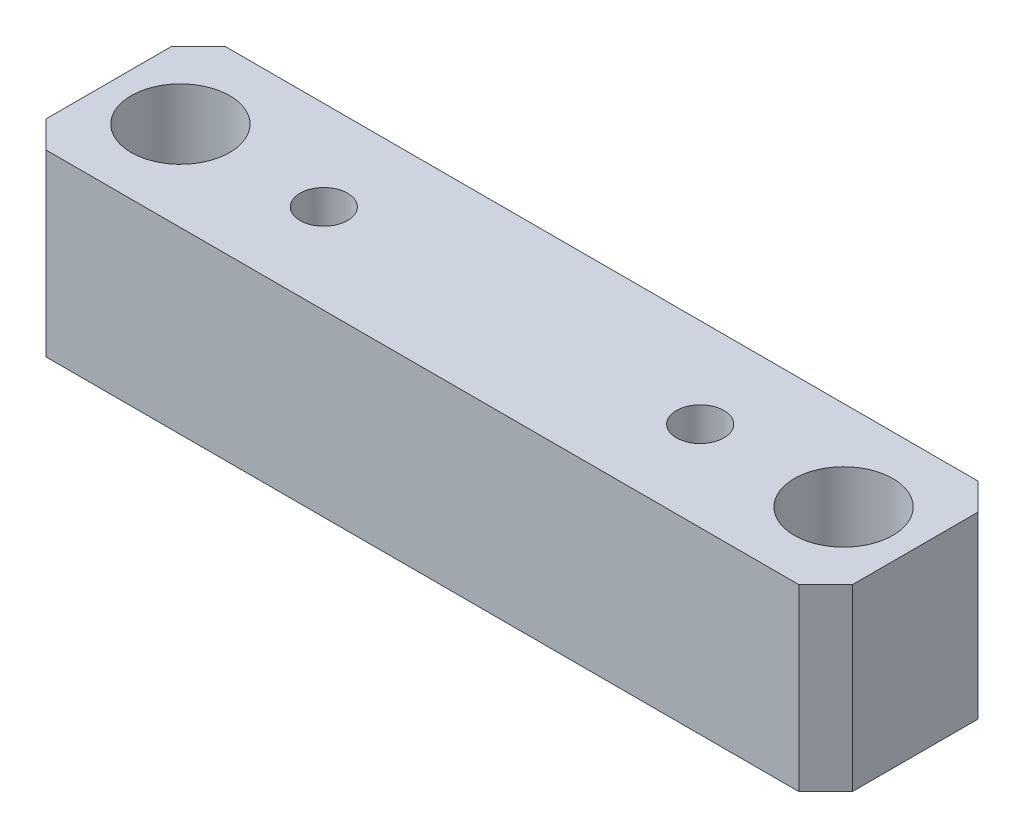
ISO-10303-21;
HEADER;
FILE_DESCRIPTION(('STEP AP214'),'2;1');
FILE_NAME('part.step','',(''),(''),'','','');
FILE_SCHEMA(('AUTOMOTIVE_DESIGN { 1 0 10303 214 1 1 1 1 }'));
ENDSEC;
DATA;
#1=APPLICATION_CONTEXT('core data for automotive mechanical design processes');
#2=APPLICATION_PROTOCOL_DEFINITION('international standard','automotive_design',2000,#1);
#3=PRODUCT_CONTEXT('',#1,'mechanical');
#4=PRODUCT('Part','Part','',(#3));
#5=PRODUCT_RELATED_PRODUCT_CATEGORY('part','',(#4));
#6=PRODUCT_DEFINITION_FORMATION('','',#4);
#7=PRODUCT_DEFINITION_CONTEXT('part definition',#1,'design');
#8=PRODUCT_DEFINITION('design','',#6,#7);
#9=PRODUCT_DEFINITION_SHAPE('','',#8);
#10=(LENGTH_UNIT() NAMED_UNIT(*) SI_UNIT(.MILLI.,.METRE.));
#11=(NAMED_UNIT(*) PLANE_ANGLE_UNIT() SI_UNIT($,.RADIAN.));
#12=(NAMED_UNIT(*) SI_UNIT($,.STERADIAN.) SOLID_ANGLE_UNIT());
#13=UNCERTAINTY_MEASURE_WITH_UNIT(LENGTH_MEASURE(1.E-05),#10,'distance_accuracy_value','');
#14=(GEOMETRIC_REPRESENTATION_CONTEXT(3) GLOBAL_UNCERTAINTY_ASSIGNED_CONTEXT((#13)) GLOBAL_UNIT_ASSIGNED_CONTEXT((#10,
#11,#12)) REPRESENTATION_CONTEXT('',''));
#15=CARTESIAN_POINT('',(0.,0.,0.));
#16=DIRECTION('',(0.,0.,1.));
#17=DIRECTION('',(1.,0.,0.));
#18=AXIS2_PLACEMENT_3D('',#15,#16,#17);
#19=CARTESIAN_POINT('',(-37.0000000000001,20.,0.));
#20=DIRECTION('',(0.,-1.,0.));
#21=DIRECTION('',(0.,0.,-1.));
#22=AXIS2_PLACEMENT_3D('',#19,#20,#21);
#23=CYLINDRICAL_SURFACE('',#22,2.75);
#24=CARTESIAN_POINT('',(-37.0000000000001,0.,0.));
#25=DIRECTION('',(0.,1.,0.));
#26=DIRECTION('',(0.,0.,1.));
#27=AXIS2_PLACEMENT_3D('',#24,#25,#26);
#28=CIRCLE('',#27,2.75);
#29=CARTESIAN_POINT('',(-37.0000000000001,0.,2.75));
#30=VERTEX_POINT('',#29);
#31=EDGE_CURVE('E334',#30,#30,#28,.T.);
#32=ORIENTED_EDGE('',*,*,#31,.F.);
#33=EDGE_LOOP('',(#32));
#34=FACE_BOUND('',#33,.T.);
#35=CARTESIAN_POINT('',(-37.0000000000001,6.,0.));
#36=DIRECTION('',(0.,1.,0.));
#37=DIRECTION('',(0.,0.,1.));
#38=AXIS2_PLACEMENT_3D('',#35,#36,#37);
#39=CIRCLE('',#38,2.75);
#40=CARTESIAN_POINT('',(-37.0000000000001,6.,2.75));
#41=VERTEX_POINT('',#40);
#42=EDGE_CURVE('E294',#41,#41,#39,.T.);
#43=ORIENTED_EDGE('',*,*,#42,.T.);
#44=EDGE_LOOP('',(#43));
#45=FACE_BOUND('',#44,.T.);
#46=ADVANCED_FACE('F42',(#34,#45),#23,.F.);
#47=CARTESIAN_POINT('',(36.9999999999999,20.,0.));
#48=DIRECTION('',(0.,-1.,0.));
#49=DIRECTION('',(0.,0.,-1.));
#50=AXIS2_PLACEMENT_3D('',#47,#48,#49);
#51=CYLINDRICAL_SURFACE('',#50,2.75);
#52=CARTESIAN_POINT('',(36.9999999999999,0.,0.));
#53=DIRECTION('',(0.,1.,0.));
#54=DIRECTION('',(0.,0.,1.));
#55=AXIS2_PLACEMENT_3D('',#52,#53,#54);
#56=CIRCLE('',#55,2.75);
#57=CARTESIAN_POINT('',(36.9999999999999,0.,2.75));
#58=VERTEX_POINT('',#57);
#59=EDGE_CURVE('E330',#58,#58,#56,.T.);
#60=ORIENTED_EDGE('',*,*,#59,.F.);
#61=EDGE_LOOP('',(#60));
#62=FACE_BOUND('',#61,.T.);
#63=CARTESIAN_POINT('',(36.9999999999999,6.,0.));
#64=DIRECTION('',(0.,1.,0.));
#65=DIRECTION('',(0.,0.,1.));
#66=AXIS2_PLACEMENT_3D('',#63,#64,#65);
#67=CIRCLE('',#66,2.75);
#68=CARTESIAN_POINT('',(36.9999999999999,6.,2.75));
#69=VERTEX_POINT('',#68);
#70=EDGE_CURVE('E383',#69,#69,#67,.T.);
#71=ORIENTED_EDGE('',*,*,#70,.T.);
#72=EDGE_LOOP('',(#71));
#73=FACE_BOUND('',#72,.T.);
#74=ADVANCED_FACE('F477',(#62,#73),#51,.F.);
#75=CARTESIAN_POINT('',(-21.,20.,0.));
#76=DIRECTION('',(0.,-1.,0.));
#77=DIRECTION('',(0.,0.,-1.));
#78=AXIS2_PLACEMENT_3D('',#75,#76,#77);
#79=CYLINDRICAL_SURFACE('',#78,2.65);
#80=CARTESIAN_POINT('',(-21.,20.,0.));
#81=DIRECTION('',(0.,1.,0.));
#82=DIRECTION('',(0.,0.,1.));
#83=AXIS2_PLACEMENT_3D('',#80,#81,#82);
#84=CIRCLE('',#83,2.65);
#85=CARTESIAN_POINT('',(-21.,20.,2.65));
#86=VERTEX_POINT('',#85);
#87=EDGE_CURVE('E343',#86,#86,#84,.T.);
#88=ORIENTED_EDGE('',*,*,#87,.T.);
#89=EDGE_LOOP('',(#88));
#90=FACE_BOUND('',#89,.T.);
#91=CARTESIAN_POINT('',(-21.,12.,0.));
#92=DIRECTION('',(0.,-1.,0.));
#93=DIRECTION('',(0.,0.,-1.));
#94=AXIS2_PLACEMENT_3D('',#91,#92,#93);
#95=CIRCLE('',#94,2.65);
#96=CARTESIAN_POINT('',(-21.,12.,-2.65));
#97=VERTEX_POINT('',#96);
#98=EDGE_CURVE('E335',#97,#97,#95,.T.);
#99=ORIENTED_EDGE('',*,*,#98,.T.);
#100=EDGE_LOOP('',(#99));
#101=FACE_BOUND('',#100,.T.);
#102=ADVANCED_FACE('F483',(#90,#101),#79,.F.);
#103=CARTESIAN_POINT('',(21.,20.,0.));
#104=DIRECTION('',(0.,-1.,0.));
#105=DIRECTION('',(0.,0.,-1.));
#106=AXIS2_PLACEMENT_3D('',#103,#104,#105);
#107=CYLINDRICAL_SURFACE('',#106,2.65);
#108=CARTESIAN_POINT('',(21.,20.,0.));
#109=DIRECTION('',(0.,1.,0.));
#110=DIRECTION('',(0.,0.,1.));
#111=AXIS2_PLACEMENT_3D('',#108,#109,#110);
#112=CIRCLE('',#111,2.65);
#113=CARTESIAN_POINT('',(21.,20.,2.64999999999999));
#114=VERTEX_POINT('',#113);
#115=EDGE_CURVE('E339',#114,#114,#112,.T.);
#116=ORIENTED_EDGE('',*,*,#115,.T.);
#117=EDGE_LOOP('',(#116));
#118=FACE_BOUND('',#117,.T.);
#119=CARTESIAN_POINT('',(21.,12.,0.));
#120=DIRECTION('',(0.,-1.,0.));
#121=DIRECTION('',(0.,0.,-1.));
#122=AXIS2_PLACEMENT_3D('',#119,#120,#121);
#123=CIRCLE('',#122,2.65);
#124=CARTESIAN_POINT('',(21.,12.,-2.65000000000001));
#125=VERTEX_POINT('',#124);
#126=EDGE_CURVE('E252',#125,#125,#123,.T.);
#127=ORIENTED_EDGE('',*,*,#126,.T.);
#128=EDGE_LOOP('',(#127));
#129=FACE_BOUND('',#128,.T.);
#130=ADVANCED_FACE('F490',(#118,#129),#107,.F.);
#131=CARTESIAN_POINT('',(0.,20.,0.));
#132=DIRECTION('',(0.,-1.,0.));
#133=DIRECTION('',(0.,0.,-1.));
#134=AXIS2_PLACEMENT_3D('',#131,#132,#133);
#135=PLANE('',#134);
#136=CARTESIAN_POINT('',(-37.0000000000001,20.,0.));
#137=DIRECTION('',(0.,1.,0.));
#138=DIRECTION('',(0.,0.,1.));
#139=AXIS2_PLACEMENT_3D('',#136,#137,#138);
#140=CIRCLE('',#139,5.5);
#141=CARTESIAN_POINT('',(-37.0000000000001,20.,5.5));
#142=VERTEX_POINT('',#141);
#143=EDGE_CURVE('E812',#142,#142,#140,.T.);
#144=ORIENTED_EDGE('',*,*,#143,.F.);
#145=EDGE_LOOP('',(#144));
#146=FACE_BOUND('',#145,.T.);
#147=CARTESIAN_POINT('',(36.9999999999999,20.,0.));
#148=DIRECTION('',(0.,1.,0.));
#149=DIRECTION('',(0.,0.,1.));
#150=AXIS2_PLACEMENT_3D('',#147,#148,#149);
#151=CIRCLE('',#150,5.5);
#152=CARTESIAN_POINT('',(36.9999999999999,20.,5.5));
#153=VERTEX_POINT('',#152);
#154=EDGE_CURVE('E218',#153,#153,#151,.T.);
#155=ORIENTED_EDGE('',*,*,#154,.F.);
#156=EDGE_LOOP('',(#155));
#157=FACE_BOUND('',#156,.T.);
#158=DIRECTION('',(1.,0.,0.));
#159=VECTOR('',#158,1.);
#160=CARTESIAN_POINT('',(-45.0000000000001,20.,10.));
#161=LINE('',#160,#159);
#162=CARTESIAN_POINT('',(-42.,20.,10.));
#163=VERTEX_POINT('',#162);
#164=CARTESIAN_POINT('',(41.9999999999999,20.,9.99999999999999));
#165=VERTEX_POINT('',#164);
#166=EDGE_CURVE('E359',#163,#165,#161,.T.);
#167=ORIENTED_EDGE('',*,*,#166,.T.);
#168=DIRECTION('',(-0.707106781186551,0.,0.707106781186544));
#169=VECTOR('',#168,1.);
#170=CARTESIAN_POINT('',(44.9999999999999,20.,6.99999999999999));
#171=LINE('',#170,#169);
#172=CARTESIAN_POINT('',(44.9999999999999,20.,6.99999999999999));
#173=VERTEX_POINT('',#172);
#174=EDGE_CURVE('E424',#165,#173,#171,.F.);
#175=ORIENTED_EDGE('',*,*,#174,.T.);
#176=DIRECTION('',(0.,0.,-1.));
#177=VECTOR('',#176,1.);
#178=CARTESIAN_POINT('',(44.9999999999999,20.,9.99999999999999));
#179=LINE('',#178,#177);
#180=CARTESIAN_POINT('',(44.9999999999999,20.,-6.99999999999996));
#181=VERTEX_POINT('',#180);
#182=EDGE_CURVE('E348',#173,#181,#179,.T.);
#183=ORIENTED_EDGE('',*,*,#182,.T.);
#184=DIRECTION('',(0.707106781186546,0.,0.707106781186549));
#185=VECTOR('',#184,1.);
#186=CARTESIAN_POINT('',(41.9999999999999,20.,-9.99999999999999));
#187=LINE('',#186,#185);
#188=CARTESIAN_POINT('',(41.9999999999999,20.,-9.99999999999999));
#189=VERTEX_POINT('',#188);
#190=EDGE_CURVE('E418',#181,#189,#187,.F.);
#191=ORIENTED_EDGE('',*,*,#190,.T.);
#192=DIRECTION('',(-1.,0.,0.));
#193=VECTOR('',#192,1.);
#194=CARTESIAN_POINT('',(-45.0000000000001,20.,-9.99999999999999));
#195=LINE('',#194,#193);
#196=CARTESIAN_POINT('',(-42.,20.,-9.99999999999999));
#197=VERTEX_POINT('',#196);
#198=EDGE_CURVE('E352',#189,#197,#195,.T.);
#199=ORIENTED_EDGE('',*,*,#198,.T.);
#200=DIRECTION('',(0.707106781186549,0.,-0.707106781186546));
#201=VECTOR('',#200,1.);
#202=CARTESIAN_POINT('',(-45.0000000000001,20.,-6.99999999999999));
#203=LINE('',#202,#201);
#204=CARTESIAN_POINT('',(-45.0000000000001,20.,-6.99999999999999));
#205=VERTEX_POINT('',#204);
#206=EDGE_CURVE('E66',#197,#205,#203,.F.);
#207=ORIENTED_EDGE('',*,*,#206,.T.);
#208=DIRECTION('',(0.,0.,1.));
#209=VECTOR('',#208,1.);
#210=CARTESIAN_POINT('',(-45.0000000000001,20.,10.));
#211=LINE('',#210,#209);
#212=CARTESIAN_POINT('',(-45.0000000000001,20.,6.99999999999999));
#213=VERTEX_POINT('',#212);
#214=EDGE_CURVE('E356',#205,#213,#211,.T.);
#215=ORIENTED_EDGE('',*,*,#214,.T.);
#216=DIRECTION('',(-0.707106781186546,0.,-0.707106781186549));
#217=VECTOR('',#216,1.);
#218=CARTESIAN_POINT('',(-42.,20.,10.));
#219=LINE('',#218,#217);
#220=EDGE_CURVE('E421',#213,#163,#219,.F.);
#221=ORIENTED_EDGE('',*,*,#220,.T.);
#222=EDGE_LOOP('',(#167,#175,#183,#191,#199,#207,#215,#221));
#223=FACE_BOUND('',#222,.T.);
#224=ORIENTED_EDGE('',*,*,#87,.F.);
#225=EDGE_LOOP('',(#224));
#226=FACE_BOUND('',#225,.T.);
#227=ORIENTED_EDGE('',*,*,#115,.F.);
#228=EDGE_LOOP('',(#227));
#229=FACE_BOUND('',#228,.T.);
#230=ADVANCED_FACE('F440',(#146,#157,#223,#226,#229),#135,.F.);
#231=CARTESIAN_POINT('',(0.,0.,0.));
#232=DIRECTION('',(0.,-1.,0.));
#233=DIRECTION('',(0.,0.,-1.));
#234=AXIS2_PLACEMENT_3D('',#231,#232,#233);
#235=PLANE('',#234);
#236=DIRECTION('',(0.5,0.,0.866025403784439));
#237=VECTOR('',#236,1.);
#238=CARTESIAN_POINT('',(-18.6328638963225,0.,-4.1));
#239=LINE('',#238,#237);
#240=CARTESIAN_POINT('',(-18.6328638963225,0.,-4.1));
#241=VERTEX_POINT('',#240);
#242=CARTESIAN_POINT('',(-16.2657277926451,0.,0.));
#243=VERTEX_POINT('',#242);
#244=EDGE_CURVE('E190',#241,#243,#239,.T.);
#245=ORIENTED_EDGE('',*,*,#244,.F.);
#246=DIRECTION('',(1.,0.,0.));
#247=VECTOR('',#246,1.);
#248=CARTESIAN_POINT('',(-23.3671361036775,0.,-4.1));
#249=LINE('',#248,#247);
#250=CARTESIAN_POINT('',(-23.3671361036775,0.,-4.1));
#251=VERTEX_POINT('',#250);
#252=EDGE_CURVE('E211',#251,#241,#249,.T.);
#253=ORIENTED_EDGE('',*,*,#252,.F.);
#254=DIRECTION('',(0.5,0.,-0.866025403784439));
#255=VECTOR('',#254,1.);
#256=CARTESIAN_POINT('',(-25.7342722073549,0.,0.));
#257=LINE('',#256,#255);
#258=CARTESIAN_POINT('',(-25.7342722073549,0.,0.));
#259=VERTEX_POINT('',#258);
#260=EDGE_CURVE('E215',#259,#251,#257,.T.);
#261=ORIENTED_EDGE('',*,*,#260,.F.);
#262=DIRECTION('',(-0.5,0.,-0.866025403784439));
#263=VECTOR('',#262,1.);
#264=CARTESIAN_POINT('',(-23.3671361036775,0.,4.1));
#265=LINE('',#264,#263);
#266=CARTESIAN_POINT('',(-23.3671361036775,0.,4.1));
#267=VERTEX_POINT('',#266);
#268=EDGE_CURVE('E242',#267,#259,#265,.T.);
#269=ORIENTED_EDGE('',*,*,#268,.F.);
#270=DIRECTION('',(-1.,0.,0.));
#271=VECTOR('',#270,1.);
#272=CARTESIAN_POINT('',(-18.6328638963225,0.,4.1));
#273=LINE('',#272,#271);
#274=CARTESIAN_POINT('',(-18.6328638963225,0.,4.1));
#275=VERTEX_POINT('',#274);
#276=EDGE_CURVE('E238',#275,#267,#273,.T.);
#277=ORIENTED_EDGE('',*,*,#276,.F.);
#278=DIRECTION('',(-0.5,0.,0.866025403784438));
#279=VECTOR('',#278,1.);
#280=CARTESIAN_POINT('',(-16.2657277926451,0.,0.));
#281=LINE('',#280,#279);
#282=EDGE_CURVE('E234',#243,#275,#281,.T.);
#283=ORIENTED_EDGE('',*,*,#282,.F.);
#284=EDGE_LOOP('',(#245,#253,#261,#269,#277,#283));
#285=FACE_BOUND('',#284,.T.);
#286=DIRECTION('',(0.5,0.,0.866025403784439));
#287=VECTOR('',#286,1.);
#288=CARTESIAN_POINT('',(23.3671361036775,0.,-4.10000000000001));
#289=LINE('',#288,#287);
#290=CARTESIAN_POINT('',(23.3671361036775,0.,-4.10000000000001));
#291=VERTEX_POINT('',#290);
#292=CARTESIAN_POINT('',(25.7342722073549,0.,0.));
#293=VERTEX_POINT('',#292);
#294=EDGE_CURVE('E290',#291,#293,#289,.T.);
#295=ORIENTED_EDGE('',*,*,#294,.F.);
#296=DIRECTION('',(1.,0.,0.));
#297=VECTOR('',#296,1.);
#298=CARTESIAN_POINT('',(18.6328638963225,0.,-4.10000000000001));
#299=LINE('',#298,#297);
#300=CARTESIAN_POINT('',(18.6328638963225,0.,-4.10000000000001));
#301=VERTEX_POINT('',#300);
#302=EDGE_CURVE('E269',#301,#291,#299,.T.);
#303=ORIENTED_EDGE('',*,*,#302,.F.);
#304=DIRECTION('',(0.5,0.,-0.866025403784438));
#305=VECTOR('',#304,1.);
#306=CARTESIAN_POINT('',(16.2657277926451,0.,0.));
#307=LINE('',#306,#305);
#308=CARTESIAN_POINT('',(16.2657277926451,0.,0.));
#309=VERTEX_POINT('',#308);
#310=EDGE_CURVE('E306',#309,#301,#307,.T.);
#311=ORIENTED_EDGE('',*,*,#310,.F.);
#312=DIRECTION('',(-0.5,0.,-0.866025403784439));
#313=VECTOR('',#312,1.);
#314=CARTESIAN_POINT('',(18.6328638963225,0.,4.1));
#315=LINE('',#314,#313);
#316=CARTESIAN_POINT('',(18.6328638963225,0.,4.1));
#317=VERTEX_POINT('',#316);
#318=EDGE_CURVE('E302',#317,#309,#315,.T.);
#319=ORIENTED_EDGE('',*,*,#318,.F.);
#320=DIRECTION('',(-1.,0.,0.));
#321=VECTOR('',#320,1.);
#322=CARTESIAN_POINT('',(23.3671361036775,0.,4.1));
#323=LINE('',#322,#321);
#324=CARTESIAN_POINT('',(23.3671361036775,0.,4.1));
#325=VERTEX_POINT('',#324);
#326=EDGE_CURVE('E298',#325,#317,#323,.T.);
#327=ORIENTED_EDGE('',*,*,#326,.F.);
#328=DIRECTION('',(-0.5,0.,0.866025403784438));
#329=VECTOR('',#328,1.);
#330=CARTESIAN_POINT('',(25.7342722073549,0.,0.));
#331=LINE('',#330,#329);
#332=EDGE_CURVE('E293',#293,#325,#331,.T.);
#333=ORIENTED_EDGE('',*,*,#332,.F.);
#334=EDGE_LOOP('',(#295,#303,#311,#319,#327,#333));
#335=FACE_BOUND('',#334,.T.);
#336=ORIENTED_EDGE('',*,*,#31,.T.);
#337=EDGE_LOOP('',(#336));
#338=FACE_BOUND('',#337,.T.);
#339=DIRECTION('',(0.,0.,-1.));
#340=VECTOR('',#339,1.);
#341=CARTESIAN_POINT('',(44.9999999999999,0.,9.99999999999999));
#342=LINE('',#341,#340);
#343=CARTESIAN_POINT('',(44.9999999999999,0.,6.99999999999999));
#344=VERTEX_POINT('',#343);
#345=CARTESIAN_POINT('',(44.9999999999999,0.,-6.99999999999996));
#346=VERTEX_POINT('',#345);
#347=EDGE_CURVE('E347',#344,#346,#342,.T.);
#348=ORIENTED_EDGE('',*,*,#347,.F.);
#349=DIRECTION('',(0.707106781186551,0.,-0.707106781186544));
#350=VECTOR('',#349,1.);
#351=CARTESIAN_POINT('',(25.9999999999997,0.,26.));
#352=LINE('',#351,#350);
#353=CARTESIAN_POINT('',(41.9999999999999,0.,9.99999999999999));
#354=VERTEX_POINT('',#353);
#355=EDGE_CURVE('E406',#344,#354,#352,.F.);
#356=ORIENTED_EDGE('',*,*,#355,.T.);
#357=DIRECTION('',(1.,0.,0.));
#358=VECTOR('',#357,1.);
#359=CARTESIAN_POINT('',(-45.0000000000001,0.,10.));
#360=LINE('',#359,#358);
#361=CARTESIAN_POINT('',(-42.,0.,10.));
#362=VERTEX_POINT('',#361);
#363=EDGE_CURVE('E353',#362,#354,#360,.T.);
#364=ORIENTED_EDGE('',*,*,#363,.F.);
#365=DIRECTION('',(0.707106781186546,0.,0.707106781186549));
#366=VECTOR('',#365,1.);
#367=CARTESIAN_POINT('',(-26.0000000000001,0.,26.));
#368=LINE('',#367,#366);
#369=CARTESIAN_POINT('',(-45.0000000000001,0.,6.99999999999999));
#370=VERTEX_POINT('',#369);
#371=EDGE_CURVE('E403',#362,#370,#368,.F.);
#372=ORIENTED_EDGE('',*,*,#371,.T.);
#373=DIRECTION('',(0.,0.,1.));
#374=VECTOR('',#373,1.);
#375=CARTESIAN_POINT('',(-45.0000000000001,0.,10.));
#376=LINE('',#375,#374);
#377=CARTESIAN_POINT('',(-45.0000000000001,0.,-6.99999999999999));
#378=VERTEX_POINT('',#377);
#379=EDGE_CURVE('E371',#378,#370,#376,.T.);
#380=ORIENTED_EDGE('',*,*,#379,.F.);
#381=DIRECTION('',(-0.707106781186549,0.,0.707106781186546));
#382=VECTOR('',#381,1.);
#383=CARTESIAN_POINT('',(-25.9999999999999,0.,-26.));
#384=LINE('',#383,#382);
#385=CARTESIAN_POINT('',(-42.,0.,-9.99999999999999));
#386=VERTEX_POINT('',#385);
#387=EDGE_CURVE('E397',#378,#386,#384,.F.);
#388=ORIENTED_EDGE('',*,*,#387,.T.);
#389=DIRECTION('',(-1.,0.,0.));
#390=VECTOR('',#389,1.);
#391=CARTESIAN_POINT('',(-45.0000000000001,0.,-9.99999999999999));
#392=LINE('',#391,#390);
#393=CARTESIAN_POINT('',(41.9999999999999,0.,-9.99999999999999));
#394=VERTEX_POINT('',#393);
#395=EDGE_CURVE('E367',#394,#386,#392,.T.);
#396=ORIENTED_EDGE('',*,*,#395,.F.);
#397=DIRECTION('',(-0.707106781186546,0.,-0.707106781186549));
#398=VECTOR('',#397,1.);
#399=CARTESIAN_POINT('',(26.0000000000001,0.,-25.9999999999999));
#400=LINE('',#399,#398);
#401=EDGE_CURVE('E400',#394,#346,#400,.F.);
#402=ORIENTED_EDGE('',*,*,#401,.T.);
#403=EDGE_LOOP('',(#348,#356,#364,#372,#380,#388,#396,#402));
#404=FACE_BOUND('',#403,.T.);
#405=ORIENTED_EDGE('',*,*,#59,.T.);
#406=EDGE_LOOP('',(#405));
#407=FACE_BOUND('',#406,.T.);
#408=ADVANCED_FACE('F448',(#285,#335,#338,#404,#407),#235,.T.);
#409=CARTESIAN_POINT('',(44.9999999999999,20.,9.99999999999999));
#410=DIRECTION('',(-1.,0.,0.));
#411=DIRECTION('',(0.,0.,1.));
#412=AXIS2_PLACEMENT_3D('',#409,#410,#411);
#413=PLANE('',#412);
#414=ORIENTED_EDGE('',*,*,#182,.F.);
#415=DIRECTION('',(0.,-1.,0.));
#416=VECTOR('',#415,1.);
#417=CARTESIAN_POINT('',(44.9999999999999,20.,6.99999999999999));
#418=LINE('',#417,#416);
#419=EDGE_CURVE('E393',#173,#344,#418,.T.);
#420=ORIENTED_EDGE('',*,*,#419,.T.);
#421=ORIENTED_EDGE('',*,*,#347,.T.);
#422=DIRECTION('',(0.,1.,0.));
#423=VECTOR('',#422,1.);
#424=CARTESIAN_POINT('',(44.9999999999999,20.,-6.99999999999997));
#425=LINE('',#424,#423);
#426=EDGE_CURVE('E363',#346,#181,#425,.T.);
#427=ORIENTED_EDGE('',*,*,#426,.T.);
#428=EDGE_LOOP('',(#414,#420,#421,#427));
#429=FACE_BOUND('',#428,.T.);
#430=ADVANCED_FACE('F465',(#429),#413,.F.);
#431=CARTESIAN_POINT('',(-45.0000000000001,20.,-9.99999999999999));
#432=DIRECTION('',(0.,0.,1.));
#433=DIRECTION('',(1.,0.,0.));
#434=AXIS2_PLACEMENT_3D('',#431,#432,#433);
#435=PLANE('',#434);
#436=ORIENTED_EDGE('',*,*,#198,.F.);
#437=DIRECTION('',(0.,-1.,0.));
#438=VECTOR('',#437,1.);
#439=CARTESIAN_POINT('',(41.9999999999999,20.,-9.99999999999999));
#440=LINE('',#439,#438);
#441=EDGE_CURVE('E11',#189,#394,#440,.T.);
#442=ORIENTED_EDGE('',*,*,#441,.T.);
#443=ORIENTED_EDGE('',*,*,#395,.T.);
#444=DIRECTION('',(0.,1.,0.));
#445=VECTOR('',#444,1.);
#446=CARTESIAN_POINT('',(-42.,20.,-9.99999999999999));
#447=LINE('',#446,#445);
#448=EDGE_CURVE('E52',#386,#197,#447,.T.);
#449=ORIENTED_EDGE('',*,*,#448,.T.);
#450=EDGE_LOOP('',(#436,#442,#443,#449));
#451=FACE_BOUND('',#450,.T.);
#452=ADVANCED_FACE('F436',(#451),#435,.F.);
#453=CARTESIAN_POINT('',(-45.0000000000001,20.,10.));
#454=DIRECTION('',(1.,0.,0.));
#455=DIRECTION('',(0.,0.,-1.));
#456=AXIS2_PLACEMENT_3D('',#453,#454,#455);
#457=PLANE('',#456);
#458=ORIENTED_EDGE('',*,*,#379,.T.);
#459=DIRECTION('',(0.,1.,0.));
#460=VECTOR('',#459,1.);
#461=CARTESIAN_POINT('',(-45.0000000000001,20.,6.99999999999999));
#462=LINE('',#461,#460);
#463=EDGE_CURVE('E59',#370,#213,#462,.T.);
#464=ORIENTED_EDGE('',*,*,#463,.T.);
#465=ORIENTED_EDGE('',*,*,#214,.F.);
#466=DIRECTION('',(0.,-1.,0.));
#467=VECTOR('',#466,1.);
#468=CARTESIAN_POINT('',(-45.0000000000001,20.,-6.99999999999999));
#469=LINE('',#468,#467);
#470=EDGE_CURVE('E427',#205,#378,#469,.T.);
#471=ORIENTED_EDGE('',*,*,#470,.T.);
#472=EDGE_LOOP('',(#458,#464,#465,#471));
#473=FACE_BOUND('',#472,.T.);
#474=ADVANCED_FACE('F445',(#473),#457,.F.);
#475=CARTESIAN_POINT('',(-45.0000000000001,20.,10.));
#476=DIRECTION('',(0.,0.,-1.));
#477=DIRECTION('',(-1.,0.,0.));
#478=AXIS2_PLACEMENT_3D('',#475,#476,#477);
#479=PLANE('',#478);
#480=ORIENTED_EDGE('',*,*,#363,.T.);
#481=DIRECTION('',(0.,1.,0.));
#482=VECTOR('',#481,1.);
#483=CARTESIAN_POINT('',(41.9999999999999,20.,9.99999999999999));
#484=LINE('',#483,#482);
#485=EDGE_CURVE('E413',#354,#165,#484,.T.);
#486=ORIENTED_EDGE('',*,*,#485,.T.);
#487=ORIENTED_EDGE('',*,*,#166,.F.);
#488=DIRECTION('',(0.,-1.,0.));
#489=VECTOR('',#488,1.);
#490=CARTESIAN_POINT('',(-42.,20.,10.));
#491=LINE('',#490,#489);
#492=EDGE_CURVE('E409',#163,#362,#491,.T.);
#493=ORIENTED_EDGE('',*,*,#492,.T.);
#494=EDGE_LOOP('',(#480,#486,#487,#493));
#495=FACE_BOUND('',#494,.T.);
#496=ADVANCED_FACE('F457',(#495),#479,.F.);
#497=CARTESIAN_POINT('',(23.3671361036775,12.,-4.10000000000001));
#498=DIRECTION('',(0.866025403784438,0.,-0.5));
#499=DIRECTION('',(-0.5,0.,-0.866025403784439));
#500=AXIS2_PLACEMENT_3D('',#497,#498,#499);
#501=PLANE('',#500);
#502=ORIENTED_EDGE('',*,*,#294,.T.);
#503=DIRECTION('',(0.,-1.,0.));
#504=VECTOR('',#503,1.);
#505=CARTESIAN_POINT('',(25.7342722073549,12.,0.));
#506=LINE('',#505,#504);
#507=CARTESIAN_POINT('',(25.7342722073549,12.,0.));
#508=VERTEX_POINT('',#507);
#509=EDGE_CURVE('E289',#508,#293,#506,.T.);
#510=ORIENTED_EDGE('',*,*,#509,.F.);
#511=DIRECTION('',(0.5,0.,0.866025403784439));
#512=VECTOR('',#511,1.);
#513=CARTESIAN_POINT('',(23.3671361036775,12.,-4.10000000000001));
#514=LINE('',#513,#512);
#515=CARTESIAN_POINT('',(23.3671361036775,12.,-4.10000000000001));
#516=VERTEX_POINT('',#515);
#517=EDGE_CURVE('E264',#516,#508,#514,.T.);
#518=ORIENTED_EDGE('',*,*,#517,.F.);
#519=DIRECTION('',(0.,-1.,0.));
#520=VECTOR('',#519,1.);
#521=CARTESIAN_POINT('',(23.3671361036775,12.,-4.10000000000001));
#522=LINE('',#521,#520);
#523=EDGE_CURVE('E235',#516,#291,#522,.T.);
#524=ORIENTED_EDGE('',*,*,#523,.T.);
#525=EDGE_LOOP('',(#502,#510,#518,#524));
#526=FACE_BOUND('',#525,.T.);
#527=ADVANCED_FACE('F505',(#526),#501,.F.);
#528=CARTESIAN_POINT('',(18.6328638963225,12.,-4.10000000000001));
#529=DIRECTION('',(0.,0.,-1.));
#530=DIRECTION('',(-1.,0.,0.));
#531=AXIS2_PLACEMENT_3D('',#528,#529,#530);
#532=PLANE('',#531);
#533=ORIENTED_EDGE('',*,*,#302,.T.);
#534=ORIENTED_EDGE('',*,*,#523,.F.);
#535=DIRECTION('',(1.,0.,0.));
#536=VECTOR('',#535,1.);
#537=CARTESIAN_POINT('',(18.6328638963225,12.,-4.10000000000001));
#538=LINE('',#537,#536);
#539=CARTESIAN_POINT('',(18.6328638963225,12.,-4.10000000000001));
#540=VERTEX_POINT('',#539);
#541=EDGE_CURVE('E285',#540,#516,#538,.T.);
#542=ORIENTED_EDGE('',*,*,#541,.F.);
#543=DIRECTION('',(0.,-1.,0.));
#544=VECTOR('',#543,1.);
#545=CARTESIAN_POINT('',(18.6328638963225,12.,-4.10000000000001));
#546=LINE('',#545,#544);
#547=EDGE_CURVE('E315',#540,#301,#546,.T.);
#548=ORIENTED_EDGE('',*,*,#547,.T.);
#549=EDGE_LOOP('',(#533,#534,#542,#548));
#550=FACE_BOUND('',#549,.T.);
#551=ADVANCED_FACE('F574',(#550),#532,.F.);
#552=CARTESIAN_POINT('',(16.2657277926451,12.,0.));
#553=DIRECTION('',(-0.866025403784438,0.,-0.5));
#554=DIRECTION('',(-0.5,0.,0.866025403784439));
#555=AXIS2_PLACEMENT_3D('',#552,#553,#554);
#556=PLANE('',#555);
#557=ORIENTED_EDGE('',*,*,#310,.T.);
#558=ORIENTED_EDGE('',*,*,#547,.F.);
#559=DIRECTION('',(0.5,0.,-0.866025403784438));
#560=VECTOR('',#559,1.);
#561=CARTESIAN_POINT('',(16.2657277926451,12.,0.));
#562=LINE('',#561,#560);
#563=CARTESIAN_POINT('',(16.2657277926451,12.,0.));
#564=VERTEX_POINT('',#563);
#565=EDGE_CURVE('E281',#564,#540,#562,.T.);
#566=ORIENTED_EDGE('',*,*,#565,.F.);
#567=DIRECTION('',(0.,-1.,0.));
#568=VECTOR('',#567,1.);
#569=CARTESIAN_POINT('',(16.2657277926451,12.,0.));
#570=LINE('',#569,#568);
#571=EDGE_CURVE('E318',#564,#309,#570,.T.);
#572=ORIENTED_EDGE('',*,*,#571,.T.);
#573=EDGE_LOOP('',(#557,#558,#566,#572));
#574=FACE_BOUND('',#573,.T.);
#575=ADVANCED_FACE('F577',(#574),#556,.F.);
#576=CARTESIAN_POINT('',(18.6328638963225,12.,4.1));
#577=DIRECTION('',(-0.866025403784439,0.,0.5));
#578=DIRECTION('',(0.5,0.,0.866025403784439));
#579=AXIS2_PLACEMENT_3D('',#576,#577,#578);
#580=PLANE('',#579);
#581=ORIENTED_EDGE('',*,*,#318,.T.);
#582=ORIENTED_EDGE('',*,*,#571,.F.);
#583=DIRECTION('',(-0.5,0.,-0.866025403784439));
#584=VECTOR('',#583,1.);
#585=CARTESIAN_POINT('',(18.6328638963225,12.,4.1));
#586=LINE('',#585,#584);
#587=CARTESIAN_POINT('',(18.6328638963225,12.,4.1));
#588=VERTEX_POINT('',#587);
#589=EDGE_CURVE('E277',#588,#564,#586,.T.);
#590=ORIENTED_EDGE('',*,*,#589,.F.);
#591=DIRECTION('',(0.,-1.,0.));
#592=VECTOR('',#591,1.);
#593=CARTESIAN_POINT('',(18.6328638963225,12.,4.1));
#594=LINE('',#593,#592);
#595=EDGE_CURVE('E321',#588,#317,#594,.T.);
#596=ORIENTED_EDGE('',*,*,#595,.T.);
#597=EDGE_LOOP('',(#581,#582,#590,#596));
#598=FACE_BOUND('',#597,.T.);
#599=ADVANCED_FACE('F581',(#598),#580,.F.);
#600=CARTESIAN_POINT('',(23.3671361036775,12.,4.1));
#601=DIRECTION('',(0.,0.,1.));
#602=DIRECTION('',(1.,0.,0.));
#603=AXIS2_PLACEMENT_3D('',#600,#601,#602);
#604=PLANE('',#603);
#605=ORIENTED_EDGE('',*,*,#326,.T.);
#606=ORIENTED_EDGE('',*,*,#595,.F.);
#607=DIRECTION('',(-1.,0.,0.));
#608=VECTOR('',#607,1.);
#609=CARTESIAN_POINT('',(23.3671361036775,12.,4.1));
#610=LINE('',#609,#608);
#611=CARTESIAN_POINT('',(23.3671361036775,12.,4.1));
#612=VERTEX_POINT('',#611);
#613=EDGE_CURVE('E273',#612,#588,#610,.T.);
#614=ORIENTED_EDGE('',*,*,#613,.F.);
#615=DIRECTION('',(0.,-1.,0.));
#616=VECTOR('',#615,1.);
#617=CARTESIAN_POINT('',(23.3671361036775,12.,4.1));
#618=LINE('',#617,#616);
#619=EDGE_CURVE('E324',#612,#325,#618,.T.);
#620=ORIENTED_EDGE('',*,*,#619,.T.);
#621=EDGE_LOOP('',(#605,#606,#614,#620));
#622=FACE_BOUND('',#621,.T.);
#623=ADVANCED_FACE('F585',(#622),#604,.F.);
#624=CARTESIAN_POINT('',(25.7342722073549,12.,0.));
#625=DIRECTION('',(0.866025403784438,0.,0.500000000000001));
#626=DIRECTION('',(0.500000000000001,0.,-0.866025403784438));
#627=AXIS2_PLACEMENT_3D('',#624,#625,#626);
#628=PLANE('',#627);
#629=ORIENTED_EDGE('',*,*,#332,.T.);
#630=ORIENTED_EDGE('',*,*,#619,.F.);
#631=DIRECTION('',(-0.5,0.,0.866025403784438));
#632=VECTOR('',#631,1.);
#633=CARTESIAN_POINT('',(25.7342722073549,12.,0.));
#634=LINE('',#633,#632);
#635=EDGE_CURVE('E268',#508,#612,#634,.T.);
#636=ORIENTED_EDGE('',*,*,#635,.F.);
#637=ORIENTED_EDGE('',*,*,#509,.T.);
#638=EDGE_LOOP('',(#629,#630,#636,#637));
#639=FACE_BOUND('',#638,.T.);
#640=ADVANCED_FACE('F572',(#639),#628,.F.);
#641=CARTESIAN_POINT('',(0.,12.,0.));
#642=DIRECTION('',(0.,-1.,0.));
#643=DIRECTION('',(0.,0.,-1.));
#644=AXIS2_PLACEMENT_3D('',#641,#642,#643);
#645=PLANE('',#644);
#646=ORIENTED_EDGE('',*,*,#126,.F.);
#647=EDGE_LOOP('',(#646));
#648=FACE_BOUND('',#647,.T.);
#649=ORIENTED_EDGE('',*,*,#517,.T.);
#650=ORIENTED_EDGE('',*,*,#635,.T.);
#651=ORIENTED_EDGE('',*,*,#613,.T.);
#652=ORIENTED_EDGE('',*,*,#589,.T.);
#653=ORIENTED_EDGE('',*,*,#565,.T.);
#654=ORIENTED_EDGE('',*,*,#541,.T.);
#655=EDGE_LOOP('',(#649,#650,#651,#652,#653,#654));
#656=FACE_BOUND('',#655,.T.);
#657=ADVANCED_FACE('F569',(#648,#656),#645,.T.);
#658=CARTESIAN_POINT('',(-18.6328638963225,12.,-4.1));
#659=DIRECTION('',(0.866025403784439,0.,-0.5));
#660=DIRECTION('',(-0.5,0.,-0.866025403784439));
#661=AXIS2_PLACEMENT_3D('',#658,#659,#660);
#662=PLANE('',#661);
#663=ORIENTED_EDGE('',*,*,#244,.T.);
#664=DIRECTION('',(0.,-1.,0.));
#665=VECTOR('',#664,1.);
#666=CARTESIAN_POINT('',(-16.2657277926451,12.,0.));
#667=LINE('',#666,#665);
#668=CARTESIAN_POINT('',(-16.2657277926451,12.,0.));
#669=VERTEX_POINT('',#668);
#670=EDGE_CURVE('E183',#669,#243,#667,.T.);
#671=ORIENTED_EDGE('',*,*,#670,.F.);
#672=DIRECTION('',(0.5,0.,0.866025403784439));
#673=VECTOR('',#672,1.);
#674=CARTESIAN_POINT('',(-18.6328638963225,12.,-4.1));
#675=LINE('',#674,#673);
#676=CARTESIAN_POINT('',(-18.6328638963225,12.,-4.1));
#677=VERTEX_POINT('',#676);
#678=EDGE_CURVE('E187',#677,#669,#675,.T.);
#679=ORIENTED_EDGE('',*,*,#678,.F.);
#680=DIRECTION('',(0.,-1.,0.));
#681=VECTOR('',#680,1.);
#682=CARTESIAN_POINT('',(-18.6328638963225,12.,-4.1));
#683=LINE('',#682,#681);
#684=EDGE_CURVE('E249',#677,#241,#683,.T.);
#685=ORIENTED_EDGE('',*,*,#684,.T.);
#686=EDGE_LOOP('',(#663,#671,#679,#685));
#687=FACE_BOUND('',#686,.T.);
#688=ADVANCED_FACE('F185',(#687),#662,.F.);
#689=CARTESIAN_POINT('',(-23.3671361036775,12.,-4.1));
#690=DIRECTION('',(0.,0.,-1.));
#691=DIRECTION('',(-1.,0.,0.));
#692=AXIS2_PLACEMENT_3D('',#689,#690,#691);
#693=PLANE('',#692);
#694=ORIENTED_EDGE('',*,*,#252,.T.);
#695=ORIENTED_EDGE('',*,*,#684,.F.);
#696=DIRECTION('',(1.,0.,0.));
#697=VECTOR('',#696,1.);
#698=CARTESIAN_POINT('',(-23.3671361036775,12.,-4.1));
#699=LINE('',#698,#697);
#700=CARTESIAN_POINT('',(-23.3671361036775,12.,-4.1));
#701=VERTEX_POINT('',#700);
#702=EDGE_CURVE('E196',#701,#677,#699,.T.);
#703=ORIENTED_EDGE('',*,*,#702,.F.);
#704=DIRECTION('',(0.,-1.,0.));
#705=VECTOR('',#704,1.);
#706=CARTESIAN_POINT('',(-23.3671361036775,12.,-4.1));
#707=LINE('',#706,#705);
#708=EDGE_CURVE('E253',#701,#251,#707,.T.);
#709=ORIENTED_EDGE('',*,*,#708,.T.);
#710=EDGE_LOOP('',(#694,#695,#703,#709));
#711=FACE_BOUND('',#710,.T.);
#712=ADVANCED_FACE('F549',(#711),#693,.F.);
#713=CARTESIAN_POINT('',(-25.7342722073549,12.,0.));
#714=DIRECTION('',(-0.866025403784438,0.,-0.5));
#715=DIRECTION('',(-0.5,0.,0.866025403784439));
#716=AXIS2_PLACEMENT_3D('',#713,#714,#715);
#717=PLANE('',#716);
#718=ORIENTED_EDGE('',*,*,#260,.T.);
#719=ORIENTED_EDGE('',*,*,#708,.F.);
#720=DIRECTION('',(0.5,0.,-0.866025403784439));
#721=VECTOR('',#720,1.);
#722=CARTESIAN_POINT('',(-25.7342722073549,12.,0.));
#723=LINE('',#722,#721);
#724=CARTESIAN_POINT('',(-25.7342722073549,12.,0.));
#725=VERTEX_POINT('',#724);
#726=EDGE_CURVE('E227',#725,#701,#723,.T.);
#727=ORIENTED_EDGE('',*,*,#726,.F.);
#728=DIRECTION('',(0.,-1.,0.));
#729=VECTOR('',#728,1.);
#730=CARTESIAN_POINT('',(-25.7342722073549,12.,0.));
#731=LINE('',#730,#729);
#732=EDGE_CURVE('E256',#725,#259,#731,.T.);
#733=ORIENTED_EDGE('',*,*,#732,.T.);
#734=EDGE_LOOP('',(#718,#719,#727,#733));
#735=FACE_BOUND('',#734,.T.);
#736=ADVANCED_FACE('F552',(#735),#717,.F.);
#737=CARTESIAN_POINT('',(-23.3671361036775,12.,4.1));
#738=DIRECTION('',(-0.866025403784439,0.,0.5));
#739=DIRECTION('',(0.5,0.,0.866025403784439));
#740=AXIS2_PLACEMENT_3D('',#737,#738,#739);
#741=PLANE('',#740);
#742=ORIENTED_EDGE('',*,*,#268,.T.);
#743=ORIENTED_EDGE('',*,*,#732,.F.);
#744=DIRECTION('',(-0.5,0.,-0.866025403784439));
#745=VECTOR('',#744,1.);
#746=CARTESIAN_POINT('',(-23.3671361036775,12.,4.1));
#747=LINE('',#746,#745);
#748=CARTESIAN_POINT('',(-23.3671361036775,12.,4.1));
#749=VERTEX_POINT('',#748);
#750=EDGE_CURVE('E223',#749,#725,#747,.T.);
#751=ORIENTED_EDGE('',*,*,#750,.F.);
#752=DIRECTION('',(0.,-1.,0.));
#753=VECTOR('',#752,1.);
#754=CARTESIAN_POINT('',(-23.3671361036775,12.,4.1));
#755=LINE('',#754,#753);
#756=EDGE_CURVE('E259',#749,#267,#755,.T.);
#757=ORIENTED_EDGE('',*,*,#756,.T.);
#758=EDGE_LOOP('',(#742,#743,#751,#757));
#759=FACE_BOUND('',#758,.T.);
#760=ADVANCED_FACE('F556',(#759),#741,.F.);
#761=CARTESIAN_POINT('',(-18.6328638963225,12.,4.1));
#762=DIRECTION('',(0.,0.,1.));
#763=DIRECTION('',(1.,0.,0.));
#764=AXIS2_PLACEMENT_3D('',#761,#762,#763);
#765=PLANE('',#764);
#766=ORIENTED_EDGE('',*,*,#276,.T.);
#767=ORIENTED_EDGE('',*,*,#756,.F.);
#768=DIRECTION('',(-1.,0.,0.));
#769=VECTOR('',#768,1.);
#770=CARTESIAN_POINT('',(-18.6328638963225,12.,4.1));
#771=LINE('',#770,#769);
#772=CARTESIAN_POINT('',(-18.6328638963225,12.,4.1));
#773=VERTEX_POINT('',#772);
#774=EDGE_CURVE('E205',#773,#749,#771,.T.);
#775=ORIENTED_EDGE('',*,*,#774,.F.);
#776=DIRECTION('',(0.,-1.,0.));
#777=VECTOR('',#776,1.);
#778=CARTESIAN_POINT('',(-18.6328638963225,12.,4.1));
#779=LINE('',#778,#777);
#780=EDGE_CURVE('E195',#773,#275,#779,.T.);
#781=ORIENTED_EDGE('',*,*,#780,.T.);
#782=EDGE_LOOP('',(#766,#767,#775,#781));
#783=FACE_BOUND('',#782,.T.);
#784=ADVANCED_FACE('F560',(#783),#765,.F.);
#785=CARTESIAN_POINT('',(-16.2657277926451,12.,0.));
#786=DIRECTION('',(0.866025403784438,0.,0.5));
#787=DIRECTION('',(0.5,0.,-0.866025403784438));
#788=AXIS2_PLACEMENT_3D('',#785,#786,#787);
#789=PLANE('',#788);
#790=ORIENTED_EDGE('',*,*,#282,.T.);
#791=ORIENTED_EDGE('',*,*,#780,.F.);
#792=DIRECTION('',(-0.5,0.,0.866025403784438));
#793=VECTOR('',#792,1.);
#794=CARTESIAN_POINT('',(-16.2657277926451,12.,0.));
#795=LINE('',#794,#793);
#796=EDGE_CURVE('E199',#669,#773,#795,.T.);
#797=ORIENTED_EDGE('',*,*,#796,.F.);
#798=ORIENTED_EDGE('',*,*,#670,.T.);
#799=EDGE_LOOP('',(#790,#791,#797,#798));
#800=FACE_BOUND('',#799,.T.);
#801=ADVANCED_FACE('F200',(#800),#789,.F.);
#802=CARTESIAN_POINT('',(0.,12.,0.));
#803=DIRECTION('',(0.,-1.,0.));
#804=DIRECTION('',(0.,0.,-1.));
#805=AXIS2_PLACEMENT_3D('',#802,#803,#804);
#806=PLANE('',#805);
#807=ORIENTED_EDGE('',*,*,#98,.F.);
#808=EDGE_LOOP('',(#807));
#809=FACE_BOUND('',#808,.T.);
#810=ORIENTED_EDGE('',*,*,#678,.T.);
#811=ORIENTED_EDGE('',*,*,#796,.T.);
#812=ORIENTED_EDGE('',*,*,#774,.T.);
#813=ORIENTED_EDGE('',*,*,#750,.T.);
#814=ORIENTED_EDGE('',*,*,#726,.T.);
#815=ORIENTED_EDGE('',*,*,#702,.T.);
#816=EDGE_LOOP('',(#810,#811,#812,#813,#814,#815));
#817=FACE_BOUND('',#816,.T.);
#818=ADVANCED_FACE('F207',(#809,#817),#806,.T.);
#819=CARTESIAN_POINT('',(36.9999999999999,6.,0.));
#820=DIRECTION('',(0.,1.,0.));
#821=DIRECTION('',(0.,0.,1.));
#822=AXIS2_PLACEMENT_3D('',#819,#820,#821);
#823=CYLINDRICAL_SURFACE('',#822,5.5);
#824=CARTESIAN_POINT('',(36.9999999999999,6.,0.));
#825=DIRECTION('',(0.,1.,0.));
#826=DIRECTION('',(0.,0.,1.));
#827=AXIS2_PLACEMENT_3D('',#824,#825,#826);
#828=CIRCLE('',#827,5.5);
#829=CARTESIAN_POINT('',(36.9999999999999,6.,5.5));
#830=VERTEX_POINT('',#829);
#831=EDGE_CURVE('E806',#830,#830,#828,.T.);
#832=ORIENTED_EDGE('',*,*,#831,.F.);
#833=EDGE_LOOP('',(#832));
#834=FACE_BOUND('',#833,.T.);
#835=ORIENTED_EDGE('',*,*,#154,.T.);
#836=EDGE_LOOP('',(#835));
#837=FACE_BOUND('',#836,.T.);
#838=ADVANCED_FACE('F541',(#834,#837),#823,.F.);
#839=CARTESIAN_POINT('',(36.9999999999999,6.,0.));
#840=DIRECTION('',(0.,1.,0.));
#841=DIRECTION('',(0.,0.,1.));
#842=AXIS2_PLACEMENT_3D('',#839,#840,#841);
#843=PLANE('',#842);
#844=ORIENTED_EDGE('',*,*,#70,.F.);
#845=EDGE_LOOP('',(#844));
#846=FACE_BOUND('',#845,.T.);
#847=ORIENTED_EDGE('',*,*,#831,.T.);
#848=EDGE_LOOP('',(#847));
#849=FACE_BOUND('',#848,.T.);
#850=ADVANCED_FACE('F533',(#846,#849),#843,.T.);
#851=CARTESIAN_POINT('',(-37.0000000000001,6.,0.));
#852=DIRECTION('',(0.,1.,0.));
#853=DIRECTION('',(0.,0.,1.));
#854=AXIS2_PLACEMENT_3D('',#851,#852,#853);
#855=CYLINDRICAL_SURFACE('',#854,5.5);
#856=CARTESIAN_POINT('',(-37.0000000000001,6.,0.));
#857=DIRECTION('',(0.,1.,0.));
#858=DIRECTION('',(0.,0.,1.));
#859=AXIS2_PLACEMENT_3D('',#856,#857,#858);
#860=CIRCLE('',#859,5.5);
#861=CARTESIAN_POINT('',(-37.0000000000001,6.,5.5));
#862=VERTEX_POINT('',#861);
#863=EDGE_CURVE('E387',#862,#862,#860,.T.);
#864=ORIENTED_EDGE('',*,*,#863,.F.);
#865=EDGE_LOOP('',(#864));
#866=FACE_BOUND('',#865,.T.);
#867=ORIENTED_EDGE('',*,*,#143,.T.);
#868=EDGE_LOOP('',(#867));
#869=FACE_BOUND('',#868,.T.);
#870=ADVANCED_FACE('F527',(#866,#869),#855,.F.);
#871=CARTESIAN_POINT('',(-37.0000000000001,6.,0.));
#872=DIRECTION('',(0.,1.,0.));
#873=DIRECTION('',(0.,0.,1.));
#874=AXIS2_PLACEMENT_3D('',#871,#872,#873);
#875=PLANE('',#874);
#876=ORIENTED_EDGE('',*,*,#42,.F.);
#877=EDGE_LOOP('',(#876));
#878=FACE_BOUND('',#877,.T.);
#879=ORIENTED_EDGE('',*,*,#863,.T.);
#880=EDGE_LOOP('',(#879));
#881=FACE_BOUND('',#880,.T.);
#882=ADVANCED_FACE('F517',(#878,#881),#875,.T.);
#883=CARTESIAN_POINT('',(44.9999999999999,20.,6.99999999999999));
#884=DIRECTION('',(-0.707106781186544,0.,-0.707106781186551));
#885=DIRECTION('',(0.,-1.,0.));
#886=AXIS2_PLACEMENT_3D('',#883,#884,#885);
#887=PLANE('',#886);
#888=ORIENTED_EDGE('',*,*,#174,.F.);
#889=ORIENTED_EDGE('',*,*,#485,.F.);
#890=ORIENTED_EDGE('',*,*,#355,.F.);
#891=ORIENTED_EDGE('',*,*,#419,.F.);
#892=EDGE_LOOP('',(#888,#889,#890,#891));
#893=FACE_BOUND('',#892,.T.);
#894=ADVANCED_FACE('F463',(#893),#887,.F.);
#895=CARTESIAN_POINT('',(-42.,20.,10.));
#896=DIRECTION('',(0.707106781186549,0.,-0.707106781186546));
#897=DIRECTION('',(0.,-1.,0.));
#898=AXIS2_PLACEMENT_3D('',#895,#896,#897);
#899=PLANE('',#898);
#900=ORIENTED_EDGE('',*,*,#220,.F.);
#901=ORIENTED_EDGE('',*,*,#463,.F.);
#902=ORIENTED_EDGE('',*,*,#371,.F.);
#903=ORIENTED_EDGE('',*,*,#492,.F.);
#904=EDGE_LOOP('',(#900,#901,#902,#903));
#905=FACE_BOUND('',#904,.T.);
#906=ADVANCED_FACE('F454',(#905),#899,.F.);
#907=CARTESIAN_POINT('',(41.9999999999999,20.,-9.99999999999999));
#908=DIRECTION('',(-0.707106781186549,0.,0.707106781186546));
#909=DIRECTION('',(0.,-1.,0.));
#910=AXIS2_PLACEMENT_3D('',#907,#908,#909);
#911=PLANE('',#910);
#912=ORIENTED_EDGE('',*,*,#190,.F.);
#913=ORIENTED_EDGE('',*,*,#426,.F.);
#914=ORIENTED_EDGE('',*,*,#401,.F.);
#915=ORIENTED_EDGE('',*,*,#441,.F.);
#916=EDGE_LOOP('',(#912,#913,#914,#915));
#917=FACE_BOUND('',#916,.T.);
#918=ADVANCED_FACE('F468',(#917),#911,.F.);
#919=CARTESIAN_POINT('',(-45.0000000000001,20.,-6.99999999999999));
#920=DIRECTION('',(0.707106781186546,0.,0.707106781186549));
#921=DIRECTION('',(0.,-1.,0.));
#922=AXIS2_PLACEMENT_3D('',#919,#920,#921);
#923=PLANE('',#922);
#924=ORIENTED_EDGE('',*,*,#206,.F.);
#925=ORIENTED_EDGE('',*,*,#448,.F.);
#926=ORIENTED_EDGE('',*,*,#387,.F.);
#927=ORIENTED_EDGE('',*,*,#470,.F.);
#928=EDGE_LOOP('',(#924,#925,#926,#927));
#929=FACE_BOUND('',#928,.T.);
#930=ADVANCED_FACE('F45',(#929),#923,.F.);
#931=CLOSED_SHELL('',(#46,#74,#102,#130,#230,#408,#430,#452,#474,#496,#527,#551,#575,#599,#623,
#640,#657,#688,#712,#736,#760,#784,#801,#818,#838,#850,#870,#882,#894,#906,#918,#930));
#932=MANIFOLD_SOLID_BREP('B2',#931);
#933=ADVANCED_BREP_SHAPE_REPRESENTATION('',(#18,#932),#14);
#934=SHAPE_DEFINITION_REPRESENTATION(#9,#933);
ENDSEC;
END-ISO-10303-21;
